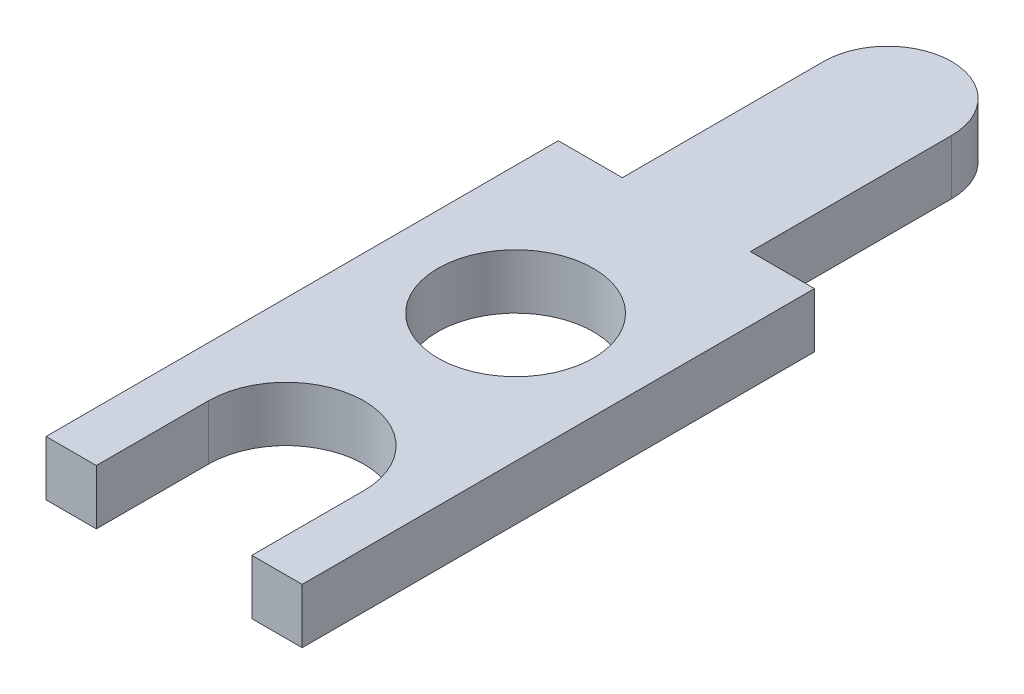
ISO-10303-21;
HEADER;
FILE_DESCRIPTION(('STEP AP214'),'2;1');
FILE_NAME('part.step','',(''),(''),'','','');
FILE_SCHEMA(('AUTOMOTIVE_DESIGN { 1 0 10303 214 1 1 1 1 }'));
ENDSEC;
DATA;
#1=APPLICATION_CONTEXT('core data for automotive mechanical design processes');
#2=APPLICATION_PROTOCOL_DEFINITION('international standard','automotive_design',2000,#1);
#3=PRODUCT_CONTEXT('',#1,'mechanical');
#4=PRODUCT('Part','Part','',(#3));
#5=PRODUCT_RELATED_PRODUCT_CATEGORY('part','',(#4));
#6=PRODUCT_DEFINITION_FORMATION('','',#4);
#7=PRODUCT_DEFINITION_CONTEXT('part definition',#1,'design');
#8=PRODUCT_DEFINITION('design','',#6,#7);
#9=PRODUCT_DEFINITION_SHAPE('','',#8);
#10=(LENGTH_UNIT() NAMED_UNIT(*) SI_UNIT(.MILLI.,.METRE.));
#11=(NAMED_UNIT(*) PLANE_ANGLE_UNIT() SI_UNIT($,.RADIAN.));
#12=(NAMED_UNIT(*) SI_UNIT($,.STERADIAN.) SOLID_ANGLE_UNIT());
#13=UNCERTAINTY_MEASURE_WITH_UNIT(LENGTH_MEASURE(1.E-05),#10,'distance_accuracy_value','');
#14=(GEOMETRIC_REPRESENTATION_CONTEXT(3) GLOBAL_UNCERTAINTY_ASSIGNED_CONTEXT((#13)) GLOBAL_UNIT_ASSIGNED_CONTEXT((#10,
#11,#12)) REPRESENTATION_CONTEXT('',''));
#15=CARTESIAN_POINT('',(0.,0.,0.));
#16=DIRECTION('',(0.,0.,1.));
#17=DIRECTION('',(1.,0.,0.));
#18=AXIS2_PLACEMENT_3D('',#15,#16,#17);
#19=CARTESIAN_POINT('',(0.85,-0.3,4.375));
#20=DIRECTION('',(1.,0.,0.));
#21=DIRECTION('',(0.,0.,1.));
#22=AXIS2_PLACEMENT_3D('',#19,#20,#21);
#23=PLANE('',#22);
#24=DIRECTION('',(0.,0.,1.));
#25=VECTOR('',#24,1.);
#26=CARTESIAN_POINT('',(0.85,-0.3,4.375));
#27=LINE('',#26,#25);
#28=CARTESIAN_POINT('',(0.85,-0.3,4.375));
#29=VERTEX_POINT('',#28);
#30=CARTESIAN_POINT('',(0.85,-0.3,5.6));
#31=VERTEX_POINT('',#30);
#32=EDGE_CURVE('E11',#29,#31,#27,.T.);
#33=ORIENTED_EDGE('',*,*,#32,.T.);
#34=DIRECTION('',(0.,1.,0.));
#35=VECTOR('',#34,1.);
#36=CARTESIAN_POINT('',(0.85,-0.3,5.6));
#37=LINE('',#36,#35);
#38=CARTESIAN_POINT('',(0.85,0.3,5.6));
#39=VERTEX_POINT('',#38);
#40=EDGE_CURVE('E24',#31,#39,#37,.T.);
#41=ORIENTED_EDGE('',*,*,#40,.T.);
#42=DIRECTION('',(0.,0.,1.));
#43=VECTOR('',#42,1.);
#44=CARTESIAN_POINT('',(0.85,0.3,4.375));
#45=LINE('',#44,#43);
#46=CARTESIAN_POINT('',(0.85,0.3,4.375));
#47=VERTEX_POINT('',#46);
#48=EDGE_CURVE('E206',#47,#39,#45,.T.);
#49=ORIENTED_EDGE('',*,*,#48,.F.);
#50=DIRECTION('',(0.,1.,0.));
#51=VECTOR('',#50,1.);
#52=CARTESIAN_POINT('',(0.85,-0.3,4.375));
#53=LINE('',#52,#51);
#54=EDGE_CURVE('E36',#29,#47,#53,.T.);
#55=ORIENTED_EDGE('',*,*,#54,.F.);
#56=EDGE_LOOP('',(#33,#41,#49,#55));
#57=FACE_BOUND('',#56,.T.);
#58=ADVANCED_FACE('F17',(#57),#23,.F.);
#59=CARTESIAN_POINT('',(0.85,-0.3,5.6));
#60=DIRECTION('',(0.,0.,-1.));
#61=DIRECTION('',(1.,0.,0.));
#62=AXIS2_PLACEMENT_3D('',#59,#60,#61);
#63=PLANE('',#62);
#64=DIRECTION('',(1.,0.,0.));
#65=VECTOR('',#64,1.);
#66=CARTESIAN_POINT('',(0.85,-0.3,5.6));
#67=LINE('',#66,#65);
#68=CARTESIAN_POINT('',(1.4,-0.3,5.6));
#69=VERTEX_POINT('',#68);
#70=EDGE_CURVE('E203',#31,#69,#67,.T.);
#71=ORIENTED_EDGE('',*,*,#70,.T.);
#72=DIRECTION('',(0.,1.,0.));
#73=VECTOR('',#72,1.);
#74=CARTESIAN_POINT('',(1.4,-0.3,5.6));
#75=LINE('',#74,#73);
#76=CARTESIAN_POINT('',(1.4,0.3,5.6));
#77=VERTEX_POINT('',#76);
#78=EDGE_CURVE('E200',#69,#77,#75,.T.);
#79=ORIENTED_EDGE('',*,*,#78,.T.);
#80=DIRECTION('',(1.,0.,0.));
#81=VECTOR('',#80,1.);
#82=CARTESIAN_POINT('',(0.85,0.3,5.6));
#83=LINE('',#82,#81);
#84=EDGE_CURVE('E198',#39,#77,#83,.T.);
#85=ORIENTED_EDGE('',*,*,#84,.F.);
#86=ORIENTED_EDGE('',*,*,#40,.F.);
#87=EDGE_LOOP('',(#71,#79,#85,#86));
#88=FACE_BOUND('',#87,.T.);
#89=ADVANCED_FACE('F209',(#88),#63,.F.);
#90=CARTESIAN_POINT('',(1.4,-0.3,5.6));
#91=DIRECTION('',(-1.,0.,0.));
#92=DIRECTION('',(0.,0.,-1.));
#93=AXIS2_PLACEMENT_3D('',#90,#91,#92);
#94=PLANE('',#93);
#95=DIRECTION('',(0.,0.,-1.));
#96=VECTOR('',#95,1.);
#97=CARTESIAN_POINT('',(1.4,-0.3,5.6));
#98=LINE('',#97,#96);
#99=CARTESIAN_POINT('',(1.4,-0.3,0.));
#100=VERTEX_POINT('',#99);
#101=EDGE_CURVE('E195',#69,#100,#98,.T.);
#102=ORIENTED_EDGE('',*,*,#101,.T.);
#103=DIRECTION('',(0.,1.,0.));
#104=VECTOR('',#103,1.);
#105=CARTESIAN_POINT('',(1.4,-0.3,0.));
#106=LINE('',#105,#104);
#107=CARTESIAN_POINT('',(1.4,0.3,0.));
#108=VERTEX_POINT('',#107);
#109=EDGE_CURVE('E192',#100,#108,#106,.T.);
#110=ORIENTED_EDGE('',*,*,#109,.T.);
#111=DIRECTION('',(0.,0.,-1.));
#112=VECTOR('',#111,1.);
#113=CARTESIAN_POINT('',(1.4,0.3,5.6));
#114=LINE('',#113,#112);
#115=EDGE_CURVE('E190',#77,#108,#114,.T.);
#116=ORIENTED_EDGE('',*,*,#115,.F.);
#117=ORIENTED_EDGE('',*,*,#78,.F.);
#118=EDGE_LOOP('',(#102,#110,#116,#117));
#119=FACE_BOUND('',#118,.T.);
#120=ADVANCED_FACE('F225',(#119),#94,.F.);
#121=CARTESIAN_POINT('',(1.4,-0.3,0.));
#122=DIRECTION('',(0.,0.,1.));
#123=DIRECTION('',(-1.,0.,0.));
#124=AXIS2_PLACEMENT_3D('',#121,#122,#123);
#125=PLANE('',#124);
#126=DIRECTION('',(-1.,0.,0.));
#127=VECTOR('',#126,1.);
#128=CARTESIAN_POINT('',(1.4,-0.3,0.));
#129=LINE('',#128,#127);
#130=CARTESIAN_POINT('',(0.7,-0.3,0.));
#131=VERTEX_POINT('',#130);
#132=EDGE_CURVE('E187',#100,#131,#129,.T.);
#133=ORIENTED_EDGE('',*,*,#132,.T.);
#134=DIRECTION('',(0.,1.,0.));
#135=VECTOR('',#134,1.);
#136=CARTESIAN_POINT('',(0.7,-0.3,0.));
#137=LINE('',#136,#135);
#138=CARTESIAN_POINT('',(0.7,0.3,0.));
#139=VERTEX_POINT('',#138);
#140=EDGE_CURVE('E184',#131,#139,#137,.T.);
#141=ORIENTED_EDGE('',*,*,#140,.T.);
#142=DIRECTION('',(-1.,0.,0.));
#143=VECTOR('',#142,1.);
#144=CARTESIAN_POINT('',(1.4,0.3,0.));
#145=LINE('',#144,#143);
#146=EDGE_CURVE('E182',#108,#139,#145,.T.);
#147=ORIENTED_EDGE('',*,*,#146,.F.);
#148=ORIENTED_EDGE('',*,*,#109,.F.);
#149=EDGE_LOOP('',(#133,#141,#147,#148));
#150=FACE_BOUND('',#149,.T.);
#151=ADVANCED_FACE('F228',(#150),#125,.F.);
#152=CARTESIAN_POINT('',(0.7,-0.3,0.));
#153=DIRECTION('',(-1.,0.,0.));
#154=DIRECTION('',(0.,0.,-1.));
#155=AXIS2_PLACEMENT_3D('',#152,#153,#154);
#156=PLANE('',#155);
#157=DIRECTION('',(0.,0.,-1.));
#158=VECTOR('',#157,1.);
#159=CARTESIAN_POINT('',(0.7,-0.3,0.));
#160=LINE('',#159,#158);
#161=CARTESIAN_POINT('',(0.7,-0.3,-2.2));
#162=VERTEX_POINT('',#161);
#163=EDGE_CURVE('E179',#131,#162,#160,.T.);
#164=ORIENTED_EDGE('',*,*,#163,.T.);
#165=DIRECTION('',(0.,1.,0.));
#166=VECTOR('',#165,1.);
#167=CARTESIAN_POINT('',(0.7,-0.3,-2.2));
#168=LINE('',#167,#166);
#169=CARTESIAN_POINT('',(0.7,0.3,-2.2));
#170=VERTEX_POINT('',#169);
#171=EDGE_CURVE('E176',#162,#170,#168,.T.);
#172=ORIENTED_EDGE('',*,*,#171,.T.);
#173=DIRECTION('',(0.,0.,-1.));
#174=VECTOR('',#173,1.);
#175=CARTESIAN_POINT('',(0.7,0.3,0.));
#176=LINE('',#175,#174);
#177=EDGE_CURVE('E174',#139,#170,#176,.T.);
#178=ORIENTED_EDGE('',*,*,#177,.F.);
#179=ORIENTED_EDGE('',*,*,#140,.F.);
#180=EDGE_LOOP('',(#164,#172,#178,#179));
#181=FACE_BOUND('',#180,.T.);
#182=ADVANCED_FACE('F233',(#181),#156,.F.);
#183=CARTESIAN_POINT('',(0.,-0.3,-2.2));
#184=DIRECTION('',(0.,-1.,0.));
#185=DIRECTION('',(-1.,0.,0.));
#186=AXIS2_PLACEMENT_3D('',#183,#184,#185);
#187=CYLINDRICAL_SURFACE('',#186,0.7);
#188=CARTESIAN_POINT('',(0.,-0.3,-2.2));
#189=DIRECTION('',(0.,1.,0.));
#190=DIRECTION('',(-1.,0.,0.));
#191=AXIS2_PLACEMENT_3D('',#188,#189,#190);
#192=CIRCLE('',#191,0.7);
#193=CARTESIAN_POINT('',(-0.7,-0.3,-2.2));
#194=VERTEX_POINT('',#193);
#195=EDGE_CURVE('E172',#162,#194,#192,.T.);
#196=ORIENTED_EDGE('',*,*,#195,.T.);
#197=DIRECTION('',(0.,1.,0.));
#198=VECTOR('',#197,1.);
#199=CARTESIAN_POINT('',(-0.7,-0.3,-2.2));
#200=LINE('',#199,#198);
#201=CARTESIAN_POINT('',(-0.7,0.3,-2.2));
#202=VERTEX_POINT('',#201);
#203=EDGE_CURVE('E170',#194,#202,#200,.T.);
#204=ORIENTED_EDGE('',*,*,#203,.T.);
#205=CARTESIAN_POINT('',(0.,0.3,-2.2));
#206=DIRECTION('',(0.,1.,0.));
#207=DIRECTION('',(-1.,0.,0.));
#208=AXIS2_PLACEMENT_3D('',#205,#206,#207);
#209=CIRCLE('',#208,0.7);
#210=EDGE_CURVE('E167',#170,#202,#209,.T.);
#211=ORIENTED_EDGE('',*,*,#210,.F.);
#212=ORIENTED_EDGE('',*,*,#171,.F.);
#213=EDGE_LOOP('',(#196,#204,#211,#212));
#214=FACE_BOUND('',#213,.T.);
#215=ADVANCED_FACE('F236',(#214),#187,.T.);
#216=CARTESIAN_POINT('',(-0.7,-0.3,0.));
#217=DIRECTION('',(-1.,0.,0.));
#218=DIRECTION('',(0.,0.,-1.));
#219=AXIS2_PLACEMENT_3D('',#216,#217,#218);
#220=PLANE('',#219);
#221=DIRECTION('',(0.,1.,0.));
#222=VECTOR('',#221,1.);
#223=CARTESIAN_POINT('',(-0.7,-0.3,0.));
#224=LINE('',#223,#222);
#225=CARTESIAN_POINT('',(-0.7,-0.3,0.));
#226=VERTEX_POINT('',#225);
#227=CARTESIAN_POINT('',(-0.7,0.3,0.));
#228=VERTEX_POINT('',#227);
#229=EDGE_CURVE('E165',#226,#228,#224,.T.);
#230=ORIENTED_EDGE('',*,*,#229,.T.);
#231=DIRECTION('',(0.,0.,-1.));
#232=VECTOR('',#231,1.);
#233=CARTESIAN_POINT('',(-0.7,0.3,0.));
#234=LINE('',#233,#232);
#235=EDGE_CURVE('E162',#228,#202,#234,.T.);
#236=ORIENTED_EDGE('',*,*,#235,.T.);
#237=ORIENTED_EDGE('',*,*,#203,.F.);
#238=DIRECTION('',(0.,0.,-1.));
#239=VECTOR('',#238,1.);
#240=CARTESIAN_POINT('',(-0.7,-0.3,0.));
#241=LINE('',#240,#239);
#242=EDGE_CURVE('E159',#226,#194,#241,.T.);
#243=ORIENTED_EDGE('',*,*,#242,.F.);
#244=EDGE_LOOP('',(#230,#236,#237,#243));
#245=FACE_BOUND('',#244,.T.);
#246=ADVANCED_FACE('F240',(#245),#220,.T.);
#247=CARTESIAN_POINT('',(-0.7,-0.3,0.));
#248=DIRECTION('',(0.,0.,1.));
#249=DIRECTION('',(-1.,0.,0.));
#250=AXIS2_PLACEMENT_3D('',#247,#248,#249);
#251=PLANE('',#250);
#252=DIRECTION('',(-1.,0.,0.));
#253=VECTOR('',#252,1.);
#254=CARTESIAN_POINT('',(-0.7,-0.3,0.));
#255=LINE('',#254,#253);
#256=CARTESIAN_POINT('',(-1.4,-0.3,0.));
#257=VERTEX_POINT('',#256);
#258=EDGE_CURVE('E156',#226,#257,#255,.T.);
#259=ORIENTED_EDGE('',*,*,#258,.T.);
#260=DIRECTION('',(0.,1.,0.));
#261=VECTOR('',#260,1.);
#262=CARTESIAN_POINT('',(-1.4,-0.3,0.));
#263=LINE('',#262,#261);
#264=CARTESIAN_POINT('',(-1.4,0.3,0.));
#265=VERTEX_POINT('',#264);
#266=EDGE_CURVE('E153',#257,#265,#263,.T.);
#267=ORIENTED_EDGE('',*,*,#266,.T.);
#268=DIRECTION('',(-1.,0.,0.));
#269=VECTOR('',#268,1.);
#270=CARTESIAN_POINT('',(-0.7,0.3,0.));
#271=LINE('',#270,#269);
#272=EDGE_CURVE('E151',#228,#265,#271,.T.);
#273=ORIENTED_EDGE('',*,*,#272,.F.);
#274=ORIENTED_EDGE('',*,*,#229,.F.);
#275=EDGE_LOOP('',(#259,#267,#273,#274));
#276=FACE_BOUND('',#275,.T.);
#277=ADVANCED_FACE('F244',(#276),#251,.F.);
#278=CARTESIAN_POINT('',(-1.4,-0.3,0.));
#279=DIRECTION('',(1.,0.,0.));
#280=DIRECTION('',(0.,0.,1.));
#281=AXIS2_PLACEMENT_3D('',#278,#279,#280);
#282=PLANE('',#281);
#283=DIRECTION('',(0.,0.,1.));
#284=VECTOR('',#283,1.);
#285=CARTESIAN_POINT('',(-1.4,-0.3,0.));
#286=LINE('',#285,#284);
#287=CARTESIAN_POINT('',(-1.4,-0.3,5.6));
#288=VERTEX_POINT('',#287);
#289=EDGE_CURVE('E148',#257,#288,#286,.T.);
#290=ORIENTED_EDGE('',*,*,#289,.T.);
#291=DIRECTION('',(0.,1.,0.));
#292=VECTOR('',#291,1.);
#293=CARTESIAN_POINT('',(-1.4,-0.3,5.6));
#294=LINE('',#293,#292);
#295=CARTESIAN_POINT('',(-1.4,0.3,5.6));
#296=VERTEX_POINT('',#295);
#297=EDGE_CURVE('E145',#288,#296,#294,.T.);
#298=ORIENTED_EDGE('',*,*,#297,.T.);
#299=DIRECTION('',(0.,0.,1.));
#300=VECTOR('',#299,1.);
#301=CARTESIAN_POINT('',(-1.4,0.3,0.));
#302=LINE('',#301,#300);
#303=EDGE_CURVE('E143',#265,#296,#302,.T.);
#304=ORIENTED_EDGE('',*,*,#303,.F.);
#305=ORIENTED_EDGE('',*,*,#266,.F.);
#306=EDGE_LOOP('',(#290,#298,#304,#305));
#307=FACE_BOUND('',#306,.T.);
#308=ADVANCED_FACE('F249',(#307),#282,.F.);
#309=CARTESIAN_POINT('',(-1.4,-0.3,5.6));
#310=DIRECTION('',(0.,0.,-1.));
#311=DIRECTION('',(1.,0.,0.));
#312=AXIS2_PLACEMENT_3D('',#309,#310,#311);
#313=PLANE('',#312);
#314=DIRECTION('',(1.,0.,0.));
#315=VECTOR('',#314,1.);
#316=CARTESIAN_POINT('',(-1.4,-0.3,5.6));
#317=LINE('',#316,#315);
#318=CARTESIAN_POINT('',(-0.85,-0.3,5.6));
#319=VERTEX_POINT('',#318);
#320=EDGE_CURVE('E140',#288,#319,#317,.T.);
#321=ORIENTED_EDGE('',*,*,#320,.T.);
#322=DIRECTION('',(0.,1.,0.));
#323=VECTOR('',#322,1.);
#324=CARTESIAN_POINT('',(-0.85,-0.3,5.6));
#325=LINE('',#324,#323);
#326=CARTESIAN_POINT('',(-0.85,0.3,5.6));
#327=VERTEX_POINT('',#326);
#328=EDGE_CURVE('E137',#319,#327,#325,.T.);
#329=ORIENTED_EDGE('',*,*,#328,.T.);
#330=DIRECTION('',(1.,0.,0.));
#331=VECTOR('',#330,1.);
#332=CARTESIAN_POINT('',(-1.4,0.3,5.6));
#333=LINE('',#332,#331);
#334=EDGE_CURVE('E135',#296,#327,#333,.T.);
#335=ORIENTED_EDGE('',*,*,#334,.F.);
#336=ORIENTED_EDGE('',*,*,#297,.F.);
#337=EDGE_LOOP('',(#321,#329,#335,#336));
#338=FACE_BOUND('',#337,.T.);
#339=ADVANCED_FACE('F251',(#338),#313,.F.);
#340=CARTESIAN_POINT('',(-0.85,-0.3,5.6));
#341=DIRECTION('',(-1.,0.,0.));
#342=DIRECTION('',(0.,0.,-1.));
#343=AXIS2_PLACEMENT_3D('',#340,#341,#342);
#344=PLANE('',#343);
#345=DIRECTION('',(0.,0.,-1.));
#346=VECTOR('',#345,1.);
#347=CARTESIAN_POINT('',(-0.85,-0.3,5.6));
#348=LINE('',#347,#346);
#349=CARTESIAN_POINT('',(-0.85,-0.3,4.375));
#350=VERTEX_POINT('',#349);
#351=EDGE_CURVE('E132',#319,#350,#348,.T.);
#352=ORIENTED_EDGE('',*,*,#351,.T.);
#353=DIRECTION('',(0.,1.,0.));
#354=VECTOR('',#353,1.);
#355=CARTESIAN_POINT('',(-0.85,-0.3,4.375));
#356=LINE('',#355,#354);
#357=CARTESIAN_POINT('',(-0.85,0.3,4.375));
#358=VERTEX_POINT('',#357);
#359=EDGE_CURVE('E129',#350,#358,#356,.T.);
#360=ORIENTED_EDGE('',*,*,#359,.T.);
#361=DIRECTION('',(0.,0.,-1.));
#362=VECTOR('',#361,1.);
#363=CARTESIAN_POINT('',(-0.85,0.3,5.6));
#364=LINE('',#363,#362);
#365=EDGE_CURVE('E127',#327,#358,#364,.T.);
#366=ORIENTED_EDGE('',*,*,#365,.F.);
#367=ORIENTED_EDGE('',*,*,#328,.F.);
#368=EDGE_LOOP('',(#352,#360,#366,#367));
#369=FACE_BOUND('',#368,.T.);
#370=ADVANCED_FACE('F253',(#369),#344,.F.);
#371=CARTESIAN_POINT('',(0.,-0.3,4.375));
#372=DIRECTION('',(0.,-1.,0.));
#373=DIRECTION('',(-1.,0.,0.));
#374=AXIS2_PLACEMENT_3D('',#371,#372,#373);
#375=CYLINDRICAL_SURFACE('',#374,0.85);
#376=ORIENTED_EDGE('',*,*,#54,.T.);
#377=CARTESIAN_POINT('',(0.,0.3,4.375));
#378=DIRECTION('',(0.,1.,0.));
#379=DIRECTION('',(-1.,0.,0.));
#380=AXIS2_PLACEMENT_3D('',#377,#378,#379);
#381=CIRCLE('',#380,0.85);
#382=EDGE_CURVE('E124',#47,#358,#381,.T.);
#383=ORIENTED_EDGE('',*,*,#382,.T.);
#384=ORIENTED_EDGE('',*,*,#359,.F.);
#385=CARTESIAN_POINT('',(0.,-0.3,4.375));
#386=DIRECTION('',(0.,1.,0.));
#387=DIRECTION('',(-1.,0.,0.));
#388=AXIS2_PLACEMENT_3D('',#385,#386,#387);
#389=CIRCLE('',#388,0.85);
#390=EDGE_CURVE('E121',#29,#350,#389,.T.);
#391=ORIENTED_EDGE('',*,*,#390,.F.);
#392=EDGE_LOOP('',(#376,#383,#384,#391));
#393=FACE_BOUND('',#392,.T.);
#394=ADVANCED_FACE('F216',(#393),#375,.F.);
#395=CARTESIAN_POINT('',(0.,-0.3,1.86648));
#396=DIRECTION('',(0.,-1.,0.));
#397=DIRECTION('',(-1.,0.,0.));
#398=AXIS2_PLACEMENT_3D('',#395,#396,#397);
#399=CYLINDRICAL_SURFACE('',#398,0.85);
#400=DIRECTION('',(0.,1.,0.));
#401=VECTOR('',#400,1.);
#402=CARTESIAN_POINT('',(-0.85,-0.3,1.86648));
#403=LINE('',#402,#401);
#404=CARTESIAN_POINT('',(-0.85,-0.3,1.86648));
#405=VERTEX_POINT('',#404);
#406=CARTESIAN_POINT('',(-0.85,0.3,1.86648));
#407=VERTEX_POINT('',#406);
#408=EDGE_CURVE('E117',#405,#407,#403,.T.);
#409=ORIENTED_EDGE('',*,*,#408,.T.);
#410=CARTESIAN_POINT('',(0.,0.3,1.86648));
#411=DIRECTION('',(0.,1.,0.));
#412=DIRECTION('',(-1.,0.,0.));
#413=AXIS2_PLACEMENT_3D('',#410,#411,#412);
#414=CIRCLE('',#413,0.85);
#415=EDGE_CURVE('E114',#407,#407,#414,.T.);
#416=ORIENTED_EDGE('',*,*,#415,.T.);
#417=ORIENTED_EDGE('',*,*,#408,.F.);
#418=CARTESIAN_POINT('',(0.,-0.3,1.86648));
#419=DIRECTION('',(0.,1.,0.));
#420=DIRECTION('',(-1.,0.,0.));
#421=AXIS2_PLACEMENT_3D('',#418,#419,#420);
#422=CIRCLE('',#421,0.85);
#423=EDGE_CURVE('E110',#405,#405,#422,.T.);
#424=ORIENTED_EDGE('',*,*,#423,.F.);
#425=EDGE_LOOP('',(#409,#416,#417,#424));
#426=FACE_BOUND('',#425,.T.);
#427=ADVANCED_FACE('F261',(#426),#399,.F.);
#428=CARTESIAN_POINT('',(0.,-0.3,1.957758468088));
#429=DIRECTION('',(0.,1.,0.));
#430=DIRECTION('',(0.,0.,1.));
#431=AXIS2_PLACEMENT_3D('',#428,#429,#430);
#432=PLANE('',#431);
#433=ORIENTED_EDGE('',*,*,#390,.T.);
#434=ORIENTED_EDGE('',*,*,#351,.F.);
#435=ORIENTED_EDGE('',*,*,#320,.F.);
#436=ORIENTED_EDGE('',*,*,#289,.F.);
#437=ORIENTED_EDGE('',*,*,#258,.F.);
#438=ORIENTED_EDGE('',*,*,#242,.T.);
#439=ORIENTED_EDGE('',*,*,#195,.F.);
#440=ORIENTED_EDGE('',*,*,#163,.F.);
#441=ORIENTED_EDGE('',*,*,#132,.F.);
#442=ORIENTED_EDGE('',*,*,#101,.F.);
#443=ORIENTED_EDGE('',*,*,#70,.F.);
#444=ORIENTED_EDGE('',*,*,#32,.F.);
#445=EDGE_LOOP('',(#433,#434,#435,#436,#437,#438,#439,#440,#441,#442,#443,#444));
#446=FACE_BOUND('',#445,.T.);
#447=ORIENTED_EDGE('',*,*,#423,.T.);
#448=EDGE_LOOP('',(#447));
#449=FACE_BOUND('',#448,.T.);
#450=ADVANCED_FACE('F111',(#446,#449),#432,.F.);
#451=CARTESIAN_POINT('',(0.,0.3,1.957758468088));
#452=DIRECTION('',(0.,1.,0.));
#453=DIRECTION('',(0.,0.,1.));
#454=AXIS2_PLACEMENT_3D('',#451,#452,#453);
#455=PLANE('',#454);
#456=ORIENTED_EDGE('',*,*,#48,.T.);
#457=ORIENTED_EDGE('',*,*,#84,.T.);
#458=ORIENTED_EDGE('',*,*,#115,.T.);
#459=ORIENTED_EDGE('',*,*,#146,.T.);
#460=ORIENTED_EDGE('',*,*,#177,.T.);
#461=ORIENTED_EDGE('',*,*,#210,.T.);
#462=ORIENTED_EDGE('',*,*,#235,.F.);
#463=ORIENTED_EDGE('',*,*,#272,.T.);
#464=ORIENTED_EDGE('',*,*,#303,.T.);
#465=ORIENTED_EDGE('',*,*,#334,.T.);
#466=ORIENTED_EDGE('',*,*,#365,.T.);
#467=ORIENTED_EDGE('',*,*,#382,.F.);
#468=EDGE_LOOP('',(#456,#457,#458,#459,#460,#461,#462,#463,#464,#465,#466,#467));
#469=FACE_BOUND('',#468,.T.);
#470=ORIENTED_EDGE('',*,*,#415,.F.);
#471=EDGE_LOOP('',(#470));
#472=FACE_BOUND('',#471,.T.);
#473=ADVANCED_FACE('F212',(#469,#472),#455,.T.);
#474=CLOSED_SHELL('',(#58,#89,#120,#151,#182,#215,#246,#277,#308,#339,#370,#394,#427,#450,#473));
#475=MANIFOLD_SOLID_BREP('B1',#474);
#476=ADVANCED_BREP_SHAPE_REPRESENTATION('',(#18,#475),#14);
#477=SHAPE_DEFINITION_REPRESENTATION(#9,#476);
ENDSEC;
END-ISO-10303-21;
